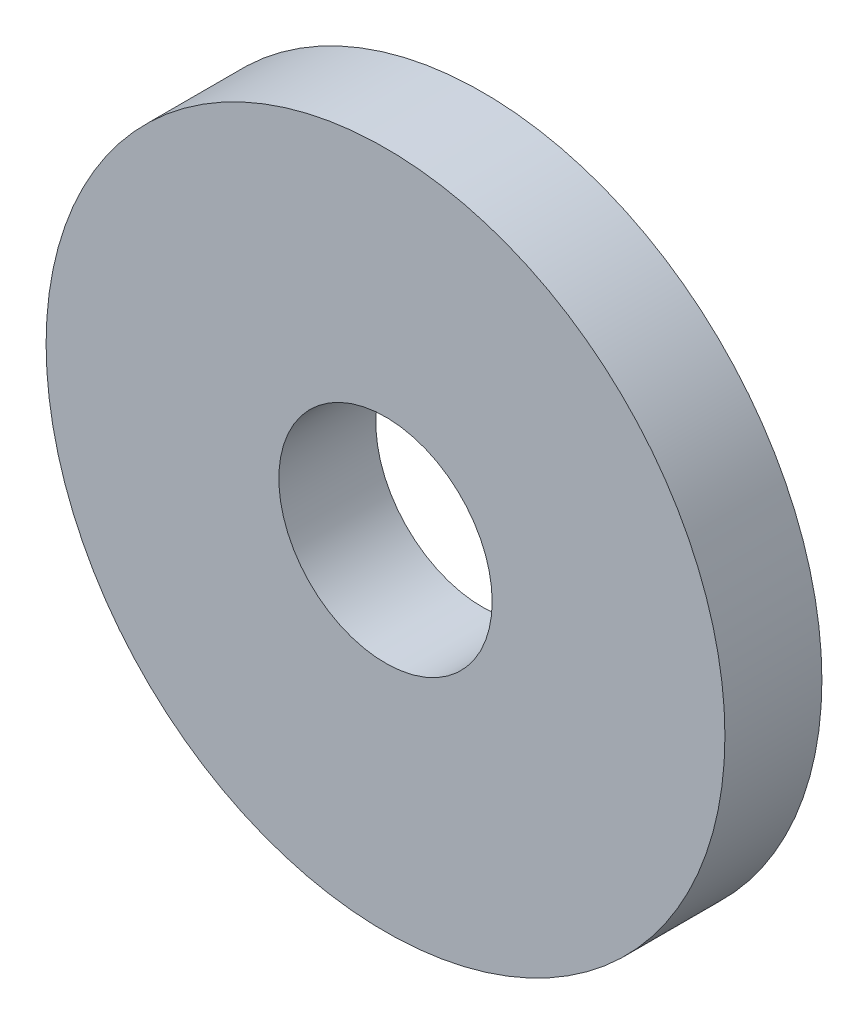
ISO-10303-21;
HEADER;
FILE_DESCRIPTION(('STEP AP214'),'2;1');
FILE_NAME('part.step','',(''),(''),'','','');
FILE_SCHEMA(('AUTOMOTIVE_DESIGN { 1 0 10303 214 1 1 1 1 }'));
ENDSEC;
DATA;
#1=APPLICATION_CONTEXT('core data for automotive mechanical design processes');
#2=APPLICATION_PROTOCOL_DEFINITION('international standard','automotive_design',2000,#1);
#3=PRODUCT_CONTEXT('',#1,'mechanical');
#4=PRODUCT('Part','Part','',(#3));
#5=PRODUCT_RELATED_PRODUCT_CATEGORY('part','',(#4));
#6=PRODUCT_DEFINITION_FORMATION('','',#4);
#7=PRODUCT_DEFINITION_CONTEXT('part definition',#1,'design');
#8=PRODUCT_DEFINITION('design','',#6,#7);
#9=PRODUCT_DEFINITION_SHAPE('','',#8);
#10=(LENGTH_UNIT() NAMED_UNIT(*) SI_UNIT(.MILLI.,.METRE.));
#11=(NAMED_UNIT(*) PLANE_ANGLE_UNIT() SI_UNIT($,.RADIAN.));
#12=(NAMED_UNIT(*) SI_UNIT($,.STERADIAN.) SOLID_ANGLE_UNIT());
#13=UNCERTAINTY_MEASURE_WITH_UNIT(LENGTH_MEASURE(1.E-05),#10,'distance_accuracy_value','');
#14=(GEOMETRIC_REPRESENTATION_CONTEXT(3) GLOBAL_UNCERTAINTY_ASSIGNED_CONTEXT((#13)) GLOBAL_UNIT_ASSIGNED_CONTEXT((#10,
#11,#12)) REPRESENTATION_CONTEXT('',''));
#15=CARTESIAN_POINT('',(0.,0.,0.));
#16=DIRECTION('',(0.,0.,1.));
#17=DIRECTION('',(1.,0.,0.));
#18=AXIS2_PLACEMENT_3D('',#15,#16,#17);
#19=CARTESIAN_POINT('',(0.,0.,1.));
#20=DIRECTION('',(0.,0.,1.));
#21=DIRECTION('',(1.,0.,0.));
#22=AXIS2_PLACEMENT_3D('',#19,#20,#21);
#23=PLANE('',#22);
#24=CARTESIAN_POINT('',(0.,0.,1.));
#25=DIRECTION('',(0.,0.,1.));
#26=DIRECTION('',(1.,0.,0.));
#27=AXIS2_PLACEMENT_3D('',#24,#25,#26);
#28=CIRCLE('',#27,3.5);
#29=CARTESIAN_POINT('',(3.5,0.,1.));
#30=VERTEX_POINT('',#29);
#31=EDGE_CURVE('E10',#30,#30,#28,.T.);
#32=ORIENTED_EDGE('',*,*,#31,.T.);
#33=EDGE_LOOP('',(#32));
#34=FACE_BOUND('',#33,.T.);
#35=CARTESIAN_POINT('',(0.,0.,1.));
#36=DIRECTION('',(0.,0.,1.));
#37=DIRECTION('',(1.,0.,0.));
#38=AXIS2_PLACEMENT_3D('',#35,#36,#37);
#39=CIRCLE('',#38,1.1);
#40=CARTESIAN_POINT('',(1.1,0.,1.));
#41=VERTEX_POINT('',#40);
#42=EDGE_CURVE('E43',#41,#41,#39,.T.);
#43=ORIENTED_EDGE('',*,*,#42,.F.);
#44=EDGE_LOOP('',(#43));
#45=FACE_BOUND('',#44,.T.);
#46=ADVANCED_FACE('F32',(#34,#45),#23,.T.);
#47=CARTESIAN_POINT('',(0.,0.,0.));
#48=DIRECTION('',(0.,0.,1.));
#49=DIRECTION('',(1.,0.,0.));
#50=AXIS2_PLACEMENT_3D('',#47,#48,#49);
#51=PLANE('',#50);
#52=CARTESIAN_POINT('',(0.,0.,0.));
#53=DIRECTION('',(0.,0.,1.));
#54=DIRECTION('',(1.,0.,0.));
#55=AXIS2_PLACEMENT_3D('',#52,#53,#54);
#56=CIRCLE('',#55,3.5);
#57=CARTESIAN_POINT('',(3.5,0.,0.));
#58=VERTEX_POINT('',#57);
#59=EDGE_CURVE('E36',#58,#58,#56,.T.);
#60=ORIENTED_EDGE('',*,*,#59,.F.);
#61=EDGE_LOOP('',(#60));
#62=FACE_BOUND('',#61,.T.);
#63=CARTESIAN_POINT('',(0.,0.,0.));
#64=DIRECTION('',(0.,0.,1.));
#65=DIRECTION('',(1.,0.,0.));
#66=AXIS2_PLACEMENT_3D('',#63,#64,#65);
#67=CIRCLE('',#66,1.1);
#68=CARTESIAN_POINT('',(1.1,0.,0.));
#69=VERTEX_POINT('',#68);
#70=EDGE_CURVE('E45',#69,#69,#67,.T.);
#71=ORIENTED_EDGE('',*,*,#70,.T.);
#72=EDGE_LOOP('',(#71));
#73=FACE_BOUND('',#72,.T.);
#74=ADVANCED_FACE('F55',(#62,#73),#51,.F.);
#75=CARTESIAN_POINT('',(0.,0.,1.));
#76=DIRECTION('',(0.,0.,-1.));
#77=DIRECTION('',(-1.,0.,0.));
#78=AXIS2_PLACEMENT_3D('',#75,#76,#77);
#79=CYLINDRICAL_SURFACE('',#78,3.5);
#80=ORIENTED_EDGE('',*,*,#31,.F.);
#81=EDGE_LOOP('',(#80));
#82=FACE_BOUND('',#81,.T.);
#83=ORIENTED_EDGE('',*,*,#59,.T.);
#84=EDGE_LOOP('',(#83));
#85=FACE_BOUND('',#84,.T.);
#86=ADVANCED_FACE('F34',(#82,#85),#79,.T.);
#87=CARTESIAN_POINT('',(0.,0.,1.));
#88=DIRECTION('',(0.,0.,-1.));
#89=DIRECTION('',(-1.,0.,0.));
#90=AXIS2_PLACEMENT_3D('',#87,#88,#89);
#91=CYLINDRICAL_SURFACE('',#90,1.1);
#92=ORIENTED_EDGE('',*,*,#42,.T.);
#93=EDGE_LOOP('',(#92));
#94=FACE_BOUND('',#93,.T.);
#95=ORIENTED_EDGE('',*,*,#70,.F.);
#96=EDGE_LOOP('',(#95));
#97=FACE_BOUND('',#96,.T.);
#98=ADVANCED_FACE('F51',(#94,#97),#91,.F.);
#99=CLOSED_SHELL('',(#46,#74,#86,#98));
#100=MANIFOLD_SOLID_BREP('B2',#99);
#101=ADVANCED_BREP_SHAPE_REPRESENTATION('',(#18,#100),#14);
#102=SHAPE_DEFINITION_REPRESENTATION(#9,#101);
ENDSEC;
END-ISO-10303-21;
